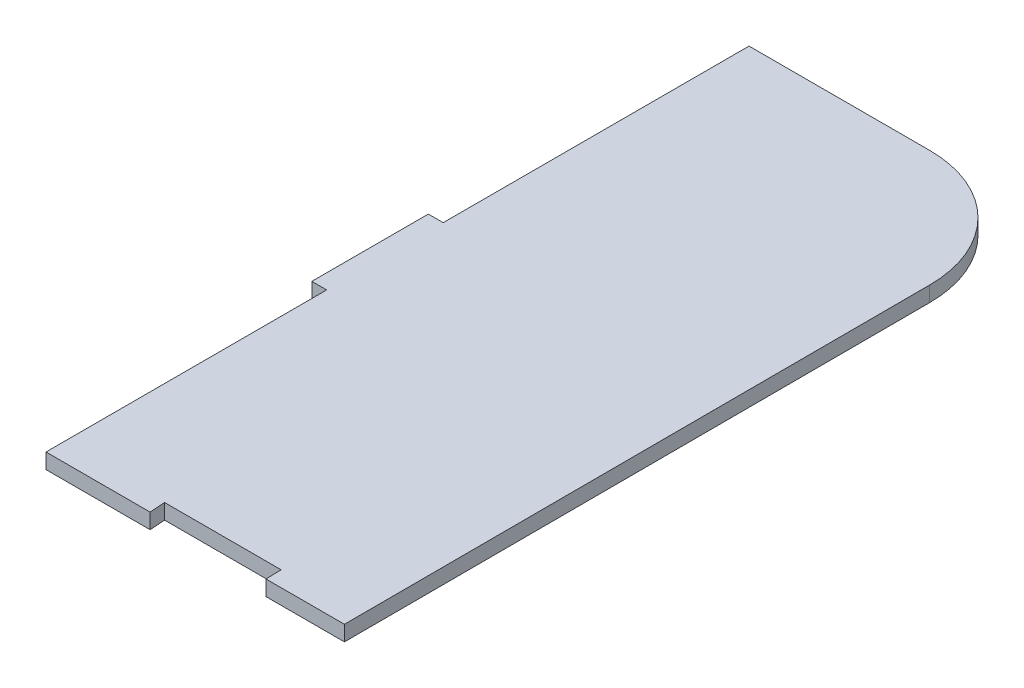
ISO-10303-21;
HEADER;
FILE_DESCRIPTION(('STEP AP214'),'2;1');
FILE_NAME('part.step','',(''),(''),'','','');
FILE_SCHEMA(('AUTOMOTIVE_DESIGN { 1 0 10303 214 1 1 1 1 }'));
ENDSEC;
DATA;
#1=APPLICATION_CONTEXT('core data for automotive mechanical design processes');
#2=APPLICATION_PROTOCOL_DEFINITION('international standard','automotive_design',2000,#1);
#3=PRODUCT_CONTEXT('',#1,'mechanical');
#4=PRODUCT('Part','Part','',(#3));
#5=PRODUCT_RELATED_PRODUCT_CATEGORY('part','',(#4));
#6=PRODUCT_DEFINITION_FORMATION('','',#4);
#7=PRODUCT_DEFINITION_CONTEXT('part definition',#1,'design');
#8=PRODUCT_DEFINITION('design','',#6,#7);
#9=PRODUCT_DEFINITION_SHAPE('','',#8);
#10=(LENGTH_UNIT() NAMED_UNIT(*) SI_UNIT(.MILLI.,.METRE.));
#11=(NAMED_UNIT(*) PLANE_ANGLE_UNIT() SI_UNIT($,.RADIAN.));
#12=(NAMED_UNIT(*) SI_UNIT($,.STERADIAN.) SOLID_ANGLE_UNIT());
#13=UNCERTAINTY_MEASURE_WITH_UNIT(LENGTH_MEASURE(1.E-05),#10,'distance_accuracy_value','');
#14=(GEOMETRIC_REPRESENTATION_CONTEXT(3) GLOBAL_UNCERTAINTY_ASSIGNED_CONTEXT((#13)) GLOBAL_UNIT_ASSIGNED_CONTEXT((#10,
#11,#12)) REPRESENTATION_CONTEXT('',''));
#15=CARTESIAN_POINT('',(0.,0.,0.));
#16=DIRECTION('',(0.,0.,1.));
#17=DIRECTION('',(1.,0.,0.));
#18=AXIS2_PLACEMENT_3D('',#15,#16,#17);
#19=CARTESIAN_POINT('',(358.121789204402,754.380000017288,884.700014425764));
#20=DIRECTION('',(0.,-1.,0.));
#21=DIRECTION('',(0.,0.,-1.));
#22=AXIS2_PLACEMENT_3D('',#19,#20,#21);
#23=PLANE('',#22);
#24=DIRECTION('',(-0.00203401334707627,0.,-0.999997931392712));
#25=VECTOR('',#24,1.);
#26=CARTESIAN_POINT('',(460.501916297315,754.380000017288,459.74));
#27=LINE('',#26,#25);
#28=CARTESIAN_POINT('',(460.501916297315,754.380000017288,459.74));
#29=VERTEX_POINT('',#28);
#30=CARTESIAN_POINT('',(459.721789204401,754.380000017288,76.2000000000128));
#31=VERTEX_POINT('',#30);
#32=EDGE_CURVE('E109',#29,#31,#27,.T.);
#33=ORIENTED_EDGE('',*,*,#32,.T.);
#34=CARTESIAN_POINT('',(383.521789204401,754.380000017288,76.2000000000128));
#35=DIRECTION('',(0.,1.,0.));
#36=DIRECTION('',(0.,0.,1.));
#37=AXIS2_PLACEMENT_3D('',#34,#35,#36);
#38=CIRCLE('',#37,76.2);
#39=CARTESIAN_POINT('',(383.521789204398,754.380000017288,0.));
#40=VERTEX_POINT('',#39);
#41=EDGE_CURVE('E244',#31,#40,#38,.T.);
#42=ORIENTED_EDGE('',*,*,#41,.T.);
#43=DIRECTION('',(-1.,0.,0.));
#44=VECTOR('',#43,1.);
#45=CARTESIAN_POINT('',(358.121789204402,754.380000017288,0.));
#46=LINE('',#45,#44);
#47=CARTESIAN_POINT('',(265.355188860333,754.380000017288,0.));
#48=VERTEX_POINT('',#47);
#49=EDGE_CURVE('E214',#40,#48,#46,.T.);
#50=ORIENTED_EDGE('',*,*,#49,.T.);
#51=DIRECTION('',(0.,0.,-1.));
#52=VECTOR('',#51,1.);
#53=CARTESIAN_POINT('',(265.355188860333,754.380000017288,0.));
#54=LINE('',#53,#52);
#55=CARTESIAN_POINT('',(265.355188860333,754.380000017288,200.));
#56=VERTEX_POINT('',#55);
#57=EDGE_CURVE('E209',#56,#48,#54,.T.);
#58=ORIENTED_EDGE('',*,*,#57,.F.);
#59=DIRECTION('',(-1.,0.,0.));
#60=VECTOR('',#59,1.);
#61=CARTESIAN_POINT('',(0.,754.380000017288,200.));
#62=LINE('',#61,#60);
#63=CARTESIAN_POINT('',(255.630013474232,754.380000017288,200.));
#64=VERTEX_POINT('',#63);
#65=EDGE_CURVE('E193',#56,#64,#62,.T.);
#66=ORIENTED_EDGE('',*,*,#65,.T.);
#67=DIRECTION('',(0.,0.,1.));
#68=VECTOR('',#67,1.);
#69=CARTESIAN_POINT('',(255.630013474232,754.380000017288,0.));
#70=LINE('',#69,#68);
#71=CARTESIAN_POINT('',(255.630013474232,754.380000017288,276.2));
#72=VERTEX_POINT('',#71);
#73=EDGE_CURVE('E207',#64,#72,#70,.T.);
#74=ORIENTED_EDGE('',*,*,#73,.T.);
#75=DIRECTION('',(-1.,0.,0.));
#76=VECTOR('',#75,1.);
#77=CARTESIAN_POINT('',(0.,754.380000017288,276.2));
#78=LINE('',#77,#76);
#79=CARTESIAN_POINT('',(265.355188860333,754.380000017288,276.2));
#80=VERTEX_POINT('',#79);
#81=EDGE_CURVE('E281',#80,#72,#78,.T.);
#82=ORIENTED_EDGE('',*,*,#81,.F.);
#83=DIRECTION('',(0.,0.,-1.));
#84=VECTOR('',#83,1.);
#85=CARTESIAN_POINT('',(265.355188860333,754.380000017288,0.));
#86=LINE('',#85,#84);
#87=CARTESIAN_POINT('',(265.355188860333,754.380000017288,459.74));
#88=VERTEX_POINT('',#87);
#89=EDGE_CURVE('E210',#88,#80,#86,.T.);
#90=ORIENTED_EDGE('',*,*,#89,.F.);
#91=DIRECTION('',(-1.,0.,0.));
#92=VECTOR('',#91,1.);
#93=CARTESIAN_POINT('',(358.121789204402,754.380000017288,459.74));
#94=LINE('',#93,#92);
#95=CARTESIAN_POINT('',(333.464234552153,754.380000017288,459.74));
#96=VERTEX_POINT('',#95);
#97=EDGE_CURVE('E225',#96,#88,#94,.T.);
#98=ORIENTED_EDGE('',*,*,#97,.F.);
#99=DIRECTION('',(-0.0728809961949456,0.,-0.997340644109941));
#100=VECTOR('',#99,1.);
#101=CARTESIAN_POINT('',(333.464234552153,754.380000017288,459.74));
#102=LINE('',#101,#100);
#103=CARTESIAN_POINT('',(332.7217892044,754.380000017288,449.57999999995));
#104=VERTEX_POINT('',#103);
#105=EDGE_CURVE('E263',#96,#104,#102,.T.);
#106=ORIENTED_EDGE('',*,*,#105,.T.);
#107=DIRECTION('',(1.,0.,0.));
#108=VECTOR('',#107,1.);
#109=CARTESIAN_POINT('',(332.7217892044,754.380000017288,449.57999999995));
#110=LINE('',#109,#108);
#111=CARTESIAN_POINT('',(408.9217892044,754.380000017288,449.57999999995));
#112=VERTEX_POINT('',#111);
#113=EDGE_CURVE('E271',#104,#112,#110,.T.);
#114=ORIENTED_EDGE('',*,*,#113,.T.);
#115=DIRECTION('',(0.0290249879859877,0.,0.999578686283583));
#116=VECTOR('',#115,1.);
#117=CARTESIAN_POINT('',(408.9217892044,754.380000017288,449.57999999995));
#118=LINE('',#117,#116);
#119=CARTESIAN_POINT('',(409.216807377542,754.380000017288,459.74));
#120=VERTEX_POINT('',#119);
#121=EDGE_CURVE('E274',#112,#120,#118,.T.);
#122=ORIENTED_EDGE('',*,*,#121,.T.);
#123=EDGE_CURVE('E231',#29,#120,#94,.T.);
#124=ORIENTED_EDGE('',*,*,#123,.F.);
#125=EDGE_LOOP('',(#33,#42,#50,#58,#66,#74,#82,#90,#98,#106,#114,#122,#124));
#126=FACE_BOUND('',#125,.T.);
#127=ADVANCED_FACE('F94',(#126),#23,.F.);
#128=CARTESIAN_POINT('',(562.803601280852,744.380000017288,884.700014425764));
#129=DIRECTION('',(0.,1.,0.));
#130=DIRECTION('',(0.,0.,1.));
#131=AXIS2_PLACEMENT_3D('',#128,#129,#130);
#132=PLANE('',#131);
#133=DIRECTION('',(-0.00203401334707627,0.,-0.999997931392712));
#134=VECTOR('',#133,1.);
#135=CARTESIAN_POINT('',(461.366712094164,744.380000017288,884.906338839059));
#136=LINE('',#135,#134);
#137=CARTESIAN_POINT('',(460.501916297315,744.380000017288,459.74));
#138=VERTEX_POINT('',#137);
#139=CARTESIAN_POINT('',(459.721789204401,744.380000017288,76.2000000000128));
#140=VERTEX_POINT('',#139);
#141=EDGE_CURVE('E297',#138,#140,#136,.T.);
#142=ORIENTED_EDGE('',*,*,#141,.F.);
#143=DIRECTION('',(1.,0.,0.));
#144=VECTOR('',#143,1.);
#145=CARTESIAN_POINT('',(562.803601280852,744.380000017288,459.74));
#146=LINE('',#145,#144);
#147=CARTESIAN_POINT('',(409.216807377542,744.380000017288,459.74));
#148=VERTEX_POINT('',#147);
#149=EDGE_CURVE('E227',#148,#138,#146,.T.);
#150=ORIENTED_EDGE('',*,*,#149,.F.);
#151=DIRECTION('',(0.0290249879859877,0.,0.999578686283583));
#152=VECTOR('',#151,1.);
#153=CARTESIAN_POINT('',(421.675459197284,744.380000017288,888.79798358484));
#154=LINE('',#153,#152);
#155=CARTESIAN_POINT('',(408.9217892044,744.380000017288,449.57999999995));
#156=VERTEX_POINT('',#155);
#157=EDGE_CURVE('E117',#156,#148,#154,.T.);
#158=ORIENTED_EDGE('',*,*,#157,.F.);
#159=DIRECTION('',(1.,0.,0.));
#160=VECTOR('',#159,1.);
#161=CARTESIAN_POINT('',(562.803601280852,744.380000017288,449.57999999995));
#162=LINE('',#161,#160);
#163=CARTESIAN_POINT('',(332.7217892044,744.380000017288,449.57999999995));
#164=VERTEX_POINT('',#163);
#165=EDGE_CURVE('E12',#164,#156,#162,.T.);
#166=ORIENTED_EDGE('',*,*,#165,.F.);
#167=DIRECTION('',(-0.0728809961949456,0.,-0.997340644109941));
#168=VECTOR('',#167,1.);
#169=CARTESIAN_POINT('',(365.571547544736,744.380000017288,899.11281174106));
#170=LINE('',#169,#168);
#171=CARTESIAN_POINT('',(333.464234552153,744.380000017288,459.74));
#172=VERTEX_POINT('',#171);
#173=EDGE_CURVE('E295',#172,#164,#170,.T.);
#174=ORIENTED_EDGE('',*,*,#173,.F.);
#175=CARTESIAN_POINT('',(265.355188860333,744.380000017288,459.74));
#176=VERTEX_POINT('',#175);
#177=EDGE_CURVE('E230',#176,#172,#146,.T.);
#178=ORIENTED_EDGE('',*,*,#177,.F.);
#179=DIRECTION('',(0.,0.,-1.));
#180=VECTOR('',#179,1.);
#181=CARTESIAN_POINT('',(265.355188860333,744.380000017288,884.700014425764));
#182=LINE('',#181,#180);
#183=CARTESIAN_POINT('',(265.355188860333,744.380000017288,276.2));
#184=VERTEX_POINT('',#183);
#185=EDGE_CURVE('E291',#176,#184,#182,.T.);
#186=ORIENTED_EDGE('',*,*,#185,.T.);
#187=DIRECTION('',(-1.,0.,0.));
#188=VECTOR('',#187,1.);
#189=CARTESIAN_POINT('',(562.803601280852,744.380000017288,276.2));
#190=LINE('',#189,#188);
#191=CARTESIAN_POINT('',(255.630013474232,744.380000017288,276.2));
#192=VERTEX_POINT('',#191);
#193=EDGE_CURVE('E286',#184,#192,#190,.T.);
#194=ORIENTED_EDGE('',*,*,#193,.T.);
#195=DIRECTION('',(0.,0.,1.));
#196=VECTOR('',#195,1.);
#197=CARTESIAN_POINT('',(255.630013474232,744.380000017288,0.));
#198=LINE('',#197,#196);
#199=CARTESIAN_POINT('',(255.630013474232,744.380000017288,200.));
#200=VERTEX_POINT('',#199);
#201=EDGE_CURVE('E215',#200,#192,#198,.T.);
#202=ORIENTED_EDGE('',*,*,#201,.F.);
#203=DIRECTION('',(-1.,0.,0.));
#204=VECTOR('',#203,1.);
#205=CARTESIAN_POINT('',(562.803601280852,744.380000017288,200.));
#206=LINE('',#205,#204);
#207=CARTESIAN_POINT('',(265.355188860333,744.380000017288,200.));
#208=VERTEX_POINT('',#207);
#209=EDGE_CURVE('E196',#208,#200,#206,.T.);
#210=ORIENTED_EDGE('',*,*,#209,.F.);
#211=DIRECTION('',(0.,0.,-1.));
#212=VECTOR('',#211,1.);
#213=CARTESIAN_POINT('',(265.355188860333,744.380000017288,884.700014425764));
#214=LINE('',#213,#212);
#215=CARTESIAN_POINT('',(265.355188860333,744.380000017288,0.));
#216=VERTEX_POINT('',#215);
#217=EDGE_CURVE('E298',#208,#216,#214,.T.);
#218=ORIENTED_EDGE('',*,*,#217,.T.);
#219=DIRECTION('',(1.,0.,0.));
#220=VECTOR('',#219,1.);
#221=CARTESIAN_POINT('',(562.803601280852,744.380000017288,0.));
#222=LINE('',#221,#220);
#223=CARTESIAN_POINT('',(383.521789204398,744.380000017288,0.));
#224=VERTEX_POINT('',#223);
#225=EDGE_CURVE('E217',#216,#224,#222,.T.);
#226=ORIENTED_EDGE('',*,*,#225,.T.);
#227=CARTESIAN_POINT('',(383.521789204401,744.380000017288,76.2000000000128));
#228=DIRECTION('',(0.,1.,0.));
#229=DIRECTION('',(0.,0.,1.));
#230=AXIS2_PLACEMENT_3D('',#227,#228,#229);
#231=CIRCLE('',#230,76.2);
#232=EDGE_CURVE('E219',#140,#224,#231,.T.);
#233=ORIENTED_EDGE('',*,*,#232,.F.);
#234=EDGE_LOOP('',(#142,#150,#158,#166,#174,#178,#186,#194,#202,#210,#218,#226,#233));
#235=FACE_BOUND('',#234,.T.);
#236=ADVANCED_FACE('F301',(#235),#132,.F.);
#237=CARTESIAN_POINT('',(-0.0522024421954481,0.751580454718931,459.74));
#238=DIRECTION('',(0.,0.,1.));
#239=DIRECTION('',(1.,0.,0.));
#240=AXIS2_PLACEMENT_3D('',#237,#238,#239);
#241=PLANE('',#240);
#242=ORIENTED_EDGE('',*,*,#149,.T.);
#243=DIRECTION('',(0.,1.,0.));
#244=VECTOR('',#243,1.);
#245=CARTESIAN_POINT('',(460.501916297315,0.751580454718931,459.74));
#246=LINE('',#245,#244);
#247=EDGE_CURVE('E237',#138,#29,#246,.T.);
#248=ORIENTED_EDGE('',*,*,#247,.T.);
#249=ORIENTED_EDGE('',*,*,#123,.T.);
#250=DIRECTION('',(0.,-1.,0.));
#251=VECTOR('',#250,1.);
#252=CARTESIAN_POINT('',(409.216807377542,691.380000017288,459.74));
#253=LINE('',#252,#251);
#254=EDGE_CURVE('E268',#120,#148,#253,.T.);
#255=ORIENTED_EDGE('',*,*,#254,.T.);
#256=EDGE_LOOP('',(#242,#248,#249,#255));
#257=FACE_BOUND('',#256,.T.);
#258=ADVANCED_FACE('F96',(#257),#241,.T.);
#259=ORIENTED_EDGE('',*,*,#177,.T.);
#260=DIRECTION('',(0.,1.,0.));
#261=VECTOR('',#260,1.);
#262=CARTESIAN_POINT('',(333.464234552153,0.751580454718931,459.74));
#263=LINE('',#262,#261);
#264=EDGE_CURVE('E201',#172,#96,#263,.T.);
#265=ORIENTED_EDGE('',*,*,#264,.T.);
#266=ORIENTED_EDGE('',*,*,#97,.T.);
#267=DIRECTION('',(0.,1.,0.));
#268=VECTOR('',#267,1.);
#269=CARTESIAN_POINT('',(265.355188860333,691.380000017288,459.74));
#270=LINE('',#269,#268);
#271=EDGE_CURVE('E284',#176,#88,#270,.T.);
#272=ORIENTED_EDGE('',*,*,#271,.F.);
#273=EDGE_LOOP('',(#259,#265,#266,#272));
#274=FACE_BOUND('',#273,.T.);
#275=ADVANCED_FACE('F326',(#274),#241,.T.);
#276=CARTESIAN_POINT('',(255.630013474232,754.380000017288,0.));
#277=DIRECTION('',(1.,0.,0.));
#278=DIRECTION('',(0.,0.,-1.));
#279=AXIS2_PLACEMENT_3D('',#276,#277,#278);
#280=PLANE('',#279);
#281=DIRECTION('',(0.,1.,0.));
#282=VECTOR('',#281,1.);
#283=CARTESIAN_POINT('',(255.630013474232,754.380000017288,200.));
#284=LINE('',#283,#282);
#285=EDGE_CURVE('E189',#200,#64,#284,.T.);
#286=ORIENTED_EDGE('',*,*,#285,.F.);
#287=ORIENTED_EDGE('',*,*,#201,.T.);
#288=DIRECTION('',(0.,1.,0.));
#289=VECTOR('',#288,1.);
#290=CARTESIAN_POINT('',(255.630013474232,754.380000017288,276.2));
#291=LINE('',#290,#289);
#292=EDGE_CURVE('E202',#192,#72,#291,.T.);
#293=ORIENTED_EDGE('',*,*,#292,.T.);
#294=ORIENTED_EDGE('',*,*,#73,.F.);
#295=EDGE_LOOP('',(#286,#287,#293,#294));
#296=FACE_BOUND('',#295,.T.);
#297=ADVANCED_FACE('F213',(#296),#280,.F.);
#298=CARTESIAN_POINT('',(0.,0.,0.));
#299=DIRECTION('',(0.,0.,-1.));
#300=DIRECTION('',(-1.,0.,0.));
#301=AXIS2_PLACEMENT_3D('',#298,#299,#300);
#302=PLANE('',#301);
#303=DIRECTION('',(0.,1.,0.));
#304=VECTOR('',#303,1.);
#305=CARTESIAN_POINT('',(383.521789204401,691.380000017288,6.38378239159465E-12));
#306=LINE('',#305,#304);
#307=EDGE_CURVE('E102',#224,#40,#306,.T.);
#308=ORIENTED_EDGE('',*,*,#307,.F.);
#309=ORIENTED_EDGE('',*,*,#225,.F.);
#310=DIRECTION('',(0.,1.,0.));
#311=VECTOR('',#310,1.);
#312=CARTESIAN_POINT('',(265.355188860333,691.380000017288,0.));
#313=LINE('',#312,#311);
#314=EDGE_CURVE('E250',#216,#48,#313,.T.);
#315=ORIENTED_EDGE('',*,*,#314,.T.);
#316=ORIENTED_EDGE('',*,*,#49,.F.);
#317=EDGE_LOOP('',(#308,#309,#315,#316));
#318=FACE_BOUND('',#317,.T.);
#319=ADVANCED_FACE('F253',(#318),#302,.T.);
#320=CARTESIAN_POINT('',(265.355188860333,691.380000017288,0.));
#321=DIRECTION('',(1.,0.,0.));
#322=DIRECTION('',(0.,0.,-1.));
#323=AXIS2_PLACEMENT_3D('',#320,#321,#322);
#324=PLANE('',#323);
#325=ORIENTED_EDGE('',*,*,#271,.T.);
#326=ORIENTED_EDGE('',*,*,#89,.T.);
#327=DIRECTION('',(0.,1.,0.));
#328=VECTOR('',#327,1.);
#329=CARTESIAN_POINT('',(265.355188860333,691.380000017288,276.2));
#330=LINE('',#329,#328);
#331=EDGE_CURVE('E283',#184,#80,#330,.T.);
#332=ORIENTED_EDGE('',*,*,#331,.F.);
#333=ORIENTED_EDGE('',*,*,#185,.F.);
#334=EDGE_LOOP('',(#325,#326,#332,#333));
#335=FACE_BOUND('',#334,.T.);
#336=ADVANCED_FACE('F312',(#335),#324,.F.);
#337=CARTESIAN_POINT('',(0.,691.380000017288,276.2));
#338=DIRECTION('',(0.,0.,-1.));
#339=DIRECTION('',(-1.,0.,0.));
#340=AXIS2_PLACEMENT_3D('',#337,#338,#339);
#341=PLANE('',#340);
#342=ORIENTED_EDGE('',*,*,#331,.T.);
#343=ORIENTED_EDGE('',*,*,#81,.T.);
#344=ORIENTED_EDGE('',*,*,#292,.F.);
#345=ORIENTED_EDGE('',*,*,#193,.F.);
#346=EDGE_LOOP('',(#342,#343,#344,#345));
#347=FACE_BOUND('',#346,.T.);
#348=ADVANCED_FACE('F304',(#347),#341,.F.);
#349=CARTESIAN_POINT('',(265.355188860333,691.380000017288,0.));
#350=DIRECTION('',(1.,0.,0.));
#351=DIRECTION('',(0.,0.,-1.));
#352=AXIS2_PLACEMENT_3D('',#349,#350,#351);
#353=PLANE('',#352);
#354=DIRECTION('',(0.,1.,0.));
#355=VECTOR('',#354,1.);
#356=CARTESIAN_POINT('',(265.355188860333,691.380000017288,200.));
#357=LINE('',#356,#355);
#358=EDGE_CURVE('E256',#208,#56,#357,.T.);
#359=ORIENTED_EDGE('',*,*,#358,.T.);
#360=ORIENTED_EDGE('',*,*,#57,.T.);
#361=ORIENTED_EDGE('',*,*,#314,.F.);
#362=ORIENTED_EDGE('',*,*,#217,.F.);
#363=EDGE_LOOP('',(#359,#360,#361,#362));
#364=FACE_BOUND('',#363,.T.);
#365=ADVANCED_FACE('F302',(#364),#353,.F.);
#366=CARTESIAN_POINT('',(0.,691.380000017288,200.));
#367=DIRECTION('',(0.,0.,-1.));
#368=DIRECTION('',(-1.,0.,0.));
#369=AXIS2_PLACEMENT_3D('',#366,#367,#368);
#370=PLANE('',#369);
#371=ORIENTED_EDGE('',*,*,#209,.T.);
#372=ORIENTED_EDGE('',*,*,#285,.T.);
#373=ORIENTED_EDGE('',*,*,#65,.F.);
#374=ORIENTED_EDGE('',*,*,#358,.F.);
#375=EDGE_LOOP('',(#371,#372,#373,#374));
#376=FACE_BOUND('',#375,.T.);
#377=ADVANCED_FACE('F191',(#376),#370,.T.);
#378=CARTESIAN_POINT('',(408.9217892044,691.380000017288,449.57999999995));
#379=DIRECTION('',(-0.999578686283583,0.,0.0290249879859877));
#380=DIRECTION('',(0.0290249879859877,0.,0.999578686283583));
#381=AXIS2_PLACEMENT_3D('',#378,#379,#380);
#382=PLANE('',#381);
#383=ORIENTED_EDGE('',*,*,#157,.T.);
#384=ORIENTED_EDGE('',*,*,#254,.F.);
#385=ORIENTED_EDGE('',*,*,#121,.F.);
#386=DIRECTION('',(0.,1.,0.));
#387=VECTOR('',#386,1.);
#388=CARTESIAN_POINT('',(408.9217892044,691.380000017288,449.57999999995));
#389=LINE('',#388,#387);
#390=EDGE_CURVE('E264',#156,#112,#389,.T.);
#391=ORIENTED_EDGE('',*,*,#390,.F.);
#392=EDGE_LOOP('',(#383,#384,#385,#391));
#393=FACE_BOUND('',#392,.T.);
#394=ADVANCED_FACE('F310',(#393),#382,.T.);
#395=CARTESIAN_POINT('',(333.464234552153,691.380000017288,459.74));
#396=DIRECTION('',(0.997340644109941,0.,-0.0728809961949456));
#397=DIRECTION('',(-0.0728809961949456,0.,-0.997340644109941));
#398=AXIS2_PLACEMENT_3D('',#395,#396,#397);
#399=PLANE('',#398);
#400=ORIENTED_EDGE('',*,*,#173,.T.);
#401=DIRECTION('',(0.,1.,0.));
#402=VECTOR('',#401,1.);
#403=CARTESIAN_POINT('',(332.7217892044,691.380000017288,449.57999999995));
#404=LINE('',#403,#402);
#405=EDGE_CURVE('E266',#164,#104,#404,.T.);
#406=ORIENTED_EDGE('',*,*,#405,.T.);
#407=ORIENTED_EDGE('',*,*,#105,.F.);
#408=ORIENTED_EDGE('',*,*,#264,.F.);
#409=EDGE_LOOP('',(#400,#406,#407,#408));
#410=FACE_BOUND('',#409,.T.);
#411=ADVANCED_FACE('F330',(#410),#399,.T.);
#412=CARTESIAN_POINT('',(332.7217892044,691.380000017288,449.57999999995));
#413=DIRECTION('',(0.,0.,1.));
#414=DIRECTION('',(1.,0.,0.));
#415=AXIS2_PLACEMENT_3D('',#412,#413,#414);
#416=PLANE('',#415);
#417=ORIENTED_EDGE('',*,*,#165,.T.);
#418=ORIENTED_EDGE('',*,*,#390,.T.);
#419=ORIENTED_EDGE('',*,*,#113,.F.);
#420=ORIENTED_EDGE('',*,*,#405,.F.);
#421=EDGE_LOOP('',(#417,#418,#419,#420));
#422=FACE_BOUND('',#421,.T.);
#423=ADVANCED_FACE('F333',(#422),#416,.T.);
#424=CARTESIAN_POINT('',(383.521789204401,691.380000017288,76.2000000000128));
#425=DIRECTION('',(0.,1.,0.));
#426=DIRECTION('',(0.,0.,1.));
#427=AXIS2_PLACEMENT_3D('',#424,#425,#426);
#428=CYLINDRICAL_SURFACE('',#427,76.2);
#429=ORIENTED_EDGE('',*,*,#232,.T.);
#430=ORIENTED_EDGE('',*,*,#307,.T.);
#431=ORIENTED_EDGE('',*,*,#41,.F.);
#432=DIRECTION('',(0.,1.,0.));
#433=VECTOR('',#432,1.);
#434=CARTESIAN_POINT('',(459.721789204401,691.380000017288,76.2000000000128));
#435=LINE('',#434,#433);
#436=EDGE_CURVE('E261',#140,#31,#435,.T.);
#437=ORIENTED_EDGE('',*,*,#436,.F.);
#438=EDGE_LOOP('',(#429,#430,#431,#437));
#439=FACE_BOUND('',#438,.T.);
#440=ADVANCED_FACE('F242',(#439),#428,.T.);
#441=CARTESIAN_POINT('',(460.501916297315,691.380000017288,459.74));
#442=DIRECTION('',(0.999997931392712,0.,-0.00203401334707627));
#443=DIRECTION('',(-0.00203401334707627,0.,-0.999997931392713));
#444=AXIS2_PLACEMENT_3D('',#441,#442,#443);
#445=PLANE('',#444);
#446=ORIENTED_EDGE('',*,*,#141,.T.);
#447=ORIENTED_EDGE('',*,*,#436,.T.);
#448=ORIENTED_EDGE('',*,*,#32,.F.);
#449=ORIENTED_EDGE('',*,*,#247,.F.);
#450=EDGE_LOOP('',(#446,#447,#448,#449));
#451=FACE_BOUND('',#450,.T.);
#452=ADVANCED_FACE('F340',(#451),#445,.T.);
#453=CLOSED_SHELL('',(#127,#236,#258,#275,#297,#319,#336,#348,#365,#377,#394,#411,#423,#440,#452));
#454=MANIFOLD_SOLID_BREP('B2',#453);
#455=ADVANCED_BREP_SHAPE_REPRESENTATION('',(#18,#454),#14);
#456=SHAPE_DEFINITION_REPRESENTATION(#9,#455);
ENDSEC;
END-ISO-10303-21;
